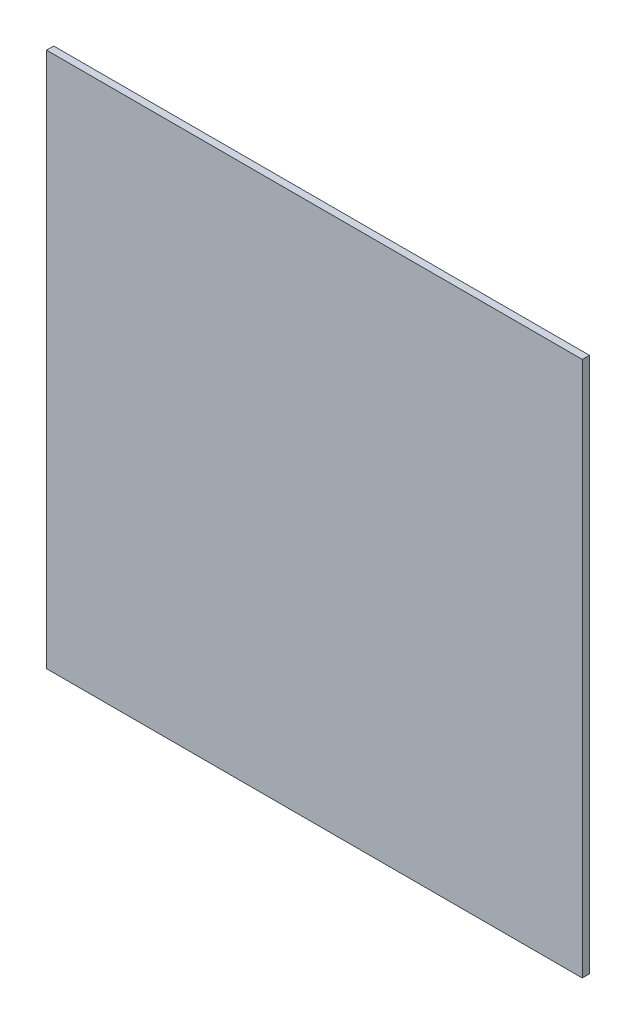
ISO-10303-21;
HEADER;
FILE_DESCRIPTION(('STEP AP214'),'2;1');
FILE_NAME('part.step','',(''),(''),'','','');
FILE_SCHEMA(('AUTOMOTIVE_DESIGN { 1 0 10303 214 1 1 1 1 }'));
ENDSEC;
DATA;
#1=APPLICATION_CONTEXT('core data for automotive mechanical design processes');
#2=APPLICATION_PROTOCOL_DEFINITION('international standard','automotive_design',2000,#1);
#3=PRODUCT_CONTEXT('',#1,'mechanical');
#4=PRODUCT('Part','Part','',(#3));
#5=PRODUCT_RELATED_PRODUCT_CATEGORY('part','',(#4));
#6=PRODUCT_DEFINITION_FORMATION('','',#4);
#7=PRODUCT_DEFINITION_CONTEXT('part definition',#1,'design');
#8=PRODUCT_DEFINITION('design','',#6,#7);
#9=PRODUCT_DEFINITION_SHAPE('','',#8);
#10=(LENGTH_UNIT() NAMED_UNIT(*) SI_UNIT(.MILLI.,.METRE.));
#11=(NAMED_UNIT(*) PLANE_ANGLE_UNIT() SI_UNIT($,.RADIAN.));
#12=(NAMED_UNIT(*) SI_UNIT($,.STERADIAN.) SOLID_ANGLE_UNIT());
#13=UNCERTAINTY_MEASURE_WITH_UNIT(LENGTH_MEASURE(1.E-05),#10,'distance_accuracy_value','');
#14=(GEOMETRIC_REPRESENTATION_CONTEXT(3) GLOBAL_UNCERTAINTY_ASSIGNED_CONTEXT((#13)) GLOBAL_UNIT_ASSIGNED_CONTEXT((#10,
#11,#12)) REPRESENTATION_CONTEXT('',''));
#15=CARTESIAN_POINT('',(0.,0.,0.));
#16=DIRECTION('',(0.,0.,1.));
#17=DIRECTION('',(1.,0.,0.));
#18=AXIS2_PLACEMENT_3D('',#15,#16,#17);
#19=CARTESIAN_POINT('',(0.,0.,3.));
#20=DIRECTION('',(1.,0.,0.));
#21=DIRECTION('',(0.,0.,-1.));
#22=AXIS2_PLACEMENT_3D('',#19,#20,#21);
#23=PLANE('',#22);
#24=DIRECTION('',(0.,-1.,0.));
#25=VECTOR('',#24,1.);
#26=CARTESIAN_POINT('',(0.,0.,0.));
#27=LINE('',#26,#25);
#28=CARTESIAN_POINT('',(0.,224.,0.));
#29=VERTEX_POINT('',#28);
#30=CARTESIAN_POINT('',(0.,0.,0.));
#31=VERTEX_POINT('',#30);
#32=EDGE_CURVE('E98',#29,#31,#27,.T.);
#33=ORIENTED_EDGE('',*,*,#32,.T.);
#34=DIRECTION('',(0.,0.,-1.));
#35=VECTOR('',#34,1.);
#36=CARTESIAN_POINT('',(0.,0.,3.));
#37=LINE('',#36,#35);
#38=CARTESIAN_POINT('',(0.,0.,3.));
#39=VERTEX_POINT('',#38);
#40=EDGE_CURVE('E11',#39,#31,#37,.T.);
#41=ORIENTED_EDGE('',*,*,#40,.F.);
#42=DIRECTION('',(0.,-1.,0.));
#43=VECTOR('',#42,1.);
#44=CARTESIAN_POINT('',(0.,0.,3.));
#45=LINE('',#44,#43);
#46=CARTESIAN_POINT('',(0.,224.,3.));
#47=VERTEX_POINT('',#46);
#48=EDGE_CURVE('E86',#47,#39,#45,.T.);
#49=ORIENTED_EDGE('',*,*,#48,.F.);
#50=DIRECTION('',(0.,0.,-1.));
#51=VECTOR('',#50,1.);
#52=CARTESIAN_POINT('',(0.,224.,3.));
#53=LINE('',#52,#51);
#54=EDGE_CURVE('E94',#47,#29,#53,.T.);
#55=ORIENTED_EDGE('',*,*,#54,.T.);
#56=EDGE_LOOP('',(#33,#41,#49,#55));
#57=FACE_BOUND('',#56,.T.);
#58=ADVANCED_FACE('F35',(#57),#23,.F.);
#59=CARTESIAN_POINT('',(0.,0.,3.));
#60=DIRECTION('',(0.,1.,0.));
#61=DIRECTION('',(0.,0.,1.));
#62=AXIS2_PLACEMENT_3D('',#59,#60,#61);
#63=PLANE('',#62);
#64=DIRECTION('',(1.,0.,0.));
#65=VECTOR('',#64,1.);
#66=CARTESIAN_POINT('',(0.,0.,0.));
#67=LINE('',#66,#65);
#68=CARTESIAN_POINT('',(224.,0.,0.));
#69=VERTEX_POINT('',#68);
#70=EDGE_CURVE('E90',#31,#69,#67,.T.);
#71=ORIENTED_EDGE('',*,*,#70,.T.);
#72=DIRECTION('',(0.,0.,-1.));
#73=VECTOR('',#72,1.);
#74=CARTESIAN_POINT('',(224.,0.,3.));
#75=LINE('',#74,#73);
#76=CARTESIAN_POINT('',(224.,0.,3.));
#77=VERTEX_POINT('',#76);
#78=EDGE_CURVE('E43',#77,#69,#75,.T.);
#79=ORIENTED_EDGE('',*,*,#78,.F.);
#80=DIRECTION('',(1.,0.,0.));
#81=VECTOR('',#80,1.);
#82=CARTESIAN_POINT('',(0.,0.,3.));
#83=LINE('',#82,#81);
#84=EDGE_CURVE('E81',#39,#77,#83,.T.);
#85=ORIENTED_EDGE('',*,*,#84,.F.);
#86=ORIENTED_EDGE('',*,*,#40,.T.);
#87=EDGE_LOOP('',(#71,#79,#85,#86));
#88=FACE_BOUND('',#87,.T.);
#89=ADVANCED_FACE('F89',(#88),#63,.F.);
#90=CARTESIAN_POINT('',(224.,0.,3.));
#91=DIRECTION('',(-1.,0.,0.));
#92=DIRECTION('',(0.,0.,1.));
#93=AXIS2_PLACEMENT_3D('',#90,#91,#92);
#94=PLANE('',#93);
#95=DIRECTION('',(0.,1.,0.));
#96=VECTOR('',#95,1.);
#97=CARTESIAN_POINT('',(224.,0.,0.));
#98=LINE('',#97,#96);
#99=CARTESIAN_POINT('',(224.,224.,0.));
#100=VERTEX_POINT('',#99);
#101=EDGE_CURVE('E68',#69,#100,#98,.T.);
#102=ORIENTED_EDGE('',*,*,#101,.T.);
#103=DIRECTION('',(0.,0.,-1.));
#104=VECTOR('',#103,1.);
#105=CARTESIAN_POINT('',(224.,224.,3.));
#106=LINE('',#105,#104);
#107=CARTESIAN_POINT('',(224.,224.,3.));
#108=VERTEX_POINT('',#107);
#109=EDGE_CURVE('E91',#108,#100,#106,.T.);
#110=ORIENTED_EDGE('',*,*,#109,.F.);
#111=DIRECTION('',(0.,1.,0.));
#112=VECTOR('',#111,1.);
#113=CARTESIAN_POINT('',(224.,0.,3.));
#114=LINE('',#113,#112);
#115=EDGE_CURVE('E84',#77,#108,#114,.T.);
#116=ORIENTED_EDGE('',*,*,#115,.F.);
#117=ORIENTED_EDGE('',*,*,#78,.T.);
#118=EDGE_LOOP('',(#102,#110,#116,#117));
#119=FACE_BOUND('',#118,.T.);
#120=ADVANCED_FACE('F92',(#119),#94,.F.);
#121=CARTESIAN_POINT('',(0.,224.,3.));
#122=DIRECTION('',(0.,-1.,0.));
#123=DIRECTION('',(0.,0.,-1.));
#124=AXIS2_PLACEMENT_3D('',#121,#122,#123);
#125=PLANE('',#124);
#126=DIRECTION('',(-1.,0.,0.));
#127=VECTOR('',#126,1.);
#128=CARTESIAN_POINT('',(0.,224.,0.));
#129=LINE('',#128,#127);
#130=EDGE_CURVE('E74',#100,#29,#129,.T.);
#131=ORIENTED_EDGE('',*,*,#130,.T.);
#132=ORIENTED_EDGE('',*,*,#54,.F.);
#133=DIRECTION('',(-1.,0.,0.));
#134=VECTOR('',#133,1.);
#135=CARTESIAN_POINT('',(0.,224.,3.));
#136=LINE('',#135,#134);
#137=EDGE_CURVE('E51',#108,#47,#136,.T.);
#138=ORIENTED_EDGE('',*,*,#137,.F.);
#139=ORIENTED_EDGE('',*,*,#109,.T.);
#140=EDGE_LOOP('',(#131,#132,#138,#139));
#141=FACE_BOUND('',#140,.T.);
#142=ADVANCED_FACE('F105',(#141),#125,.F.);
#143=CARTESIAN_POINT('',(0.,0.,3.));
#144=DIRECTION('',(0.,0.,-1.));
#145=DIRECTION('',(-1.,0.,0.));
#146=AXIS2_PLACEMENT_3D('',#143,#144,#145);
#147=PLANE('',#146);
#148=ORIENTED_EDGE('',*,*,#48,.T.);
#149=ORIENTED_EDGE('',*,*,#84,.T.);
#150=ORIENTED_EDGE('',*,*,#115,.T.);
#151=ORIENTED_EDGE('',*,*,#137,.T.);
#152=EDGE_LOOP('',(#148,#149,#150,#151));
#153=FACE_BOUND('',#152,.T.);
#154=ADVANCED_FACE('F82',(#153),#147,.F.);
#155=CARTESIAN_POINT('',(0.,0.,0.));
#156=DIRECTION('',(0.,0.,-1.));
#157=DIRECTION('',(-1.,0.,0.));
#158=AXIS2_PLACEMENT_3D('',#155,#156,#157);
#159=PLANE('',#158);
#160=ORIENTED_EDGE('',*,*,#32,.F.);
#161=ORIENTED_EDGE('',*,*,#130,.F.);
#162=ORIENTED_EDGE('',*,*,#101,.F.);
#163=ORIENTED_EDGE('',*,*,#70,.F.);
#164=EDGE_LOOP('',(#160,#161,#162,#163));
#165=FACE_BOUND('',#164,.T.);
#166=ADVANCED_FACE('F108',(#165),#159,.T.);
#167=CLOSED_SHELL('',(#58,#89,#120,#142,#154,#166));
#168=MANIFOLD_SOLID_BREP('B2',#167);
#169=ADVANCED_BREP_SHAPE_REPRESENTATION('',(#18,#168),#14);
#170=SHAPE_DEFINITION_REPRESENTATION(#9,#169);
ENDSEC;
END-ISO-10303-21;
